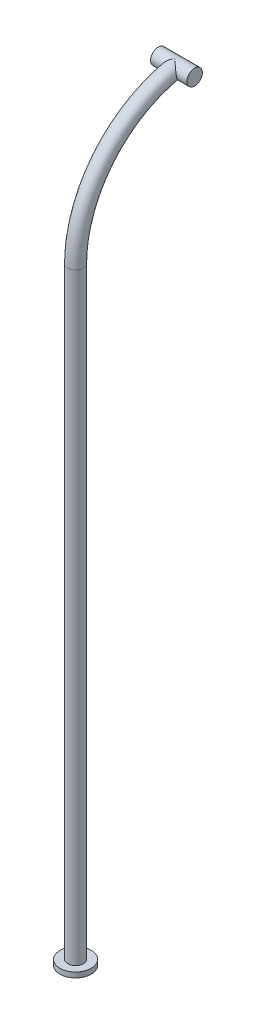
ISO-10303-21;
HEADER;
FILE_DESCRIPTION(('STEP AP214'),'2;1');
FILE_NAME('part.step','',(''),(''),'','','');
FILE_SCHEMA(('AUTOMOTIVE_DESIGN { 1 0 10303 214 1 1 1 1 }'));
ENDSEC;
DATA;
#1=APPLICATION_CONTEXT('core data for automotive mechanical design processes');
#2=APPLICATION_PROTOCOL_DEFINITION('international standard','automotive_design',2000,#1);
#3=PRODUCT_CONTEXT('',#1,'mechanical');
#4=PRODUCT('Part','Part','',(#3));
#5=PRODUCT_RELATED_PRODUCT_CATEGORY('part','',(#4));
#6=PRODUCT_DEFINITION_FORMATION('','',#4);
#7=PRODUCT_DEFINITION_CONTEXT('part definition',#1,'design');
#8=PRODUCT_DEFINITION('design','',#6,#7);
#9=PRODUCT_DEFINITION_SHAPE('','',#8);
#10=(LENGTH_UNIT() NAMED_UNIT(*) SI_UNIT(.MILLI.,.METRE.));
#11=(NAMED_UNIT(*) PLANE_ANGLE_UNIT() SI_UNIT($,.RADIAN.));
#12=(NAMED_UNIT(*) SI_UNIT($,.STERADIAN.) SOLID_ANGLE_UNIT());
#13=UNCERTAINTY_MEASURE_WITH_UNIT(LENGTH_MEASURE(1.E-05),#10,'distance_accuracy_value','');
#14=(GEOMETRIC_REPRESENTATION_CONTEXT(3) GLOBAL_UNCERTAINTY_ASSIGNED_CONTEXT((#13)) GLOBAL_UNIT_ASSIGNED_CONTEXT((#10,
#11,#12)) REPRESENTATION_CONTEXT('',''));
#15=CARTESIAN_POINT('',(0.,0.,0.));
#16=DIRECTION('',(0.,0.,1.));
#17=DIRECTION('',(1.,0.,0.));
#18=AXIS2_PLACEMENT_3D('',#15,#16,#17);
#19=CARTESIAN_POINT('',(0.,116.,0.));
#20=DIRECTION('',(0.,-1.,0.));
#21=DIRECTION('',(0.,0.,-1.));
#22=AXIS2_PLACEMENT_3D('',#19,#20,#21);
#23=CYLINDRICAL_SURFACE('',#22,1.5);
#24=CARTESIAN_POINT('',(0.,116.,0.));
#25=DIRECTION('',(0.,1.,0.));
#26=DIRECTION('',(0.,0.,1.));
#27=AXIS2_PLACEMENT_3D('',#24,#25,#26);
#28=CIRCLE('',#27,1.5);
#29=CARTESIAN_POINT('',(0.,116.,-1.5));
#30=VERTEX_POINT('',#29);
#31=EDGE_CURVE('E11',#30,#30,#28,.T.);
#32=CARTESIAN_POINT('',(0.,0.,0.));
#33=DIRECTION('',(0.,1.,0.));
#34=DIRECTION('',(0.,0.,1.));
#35=AXIS2_PLACEMENT_3D('',#32,#33,#34);
#36=CIRCLE('',#35,1.5);
#37=CARTESIAN_POINT('',(0.,0.,-1.5));
#38=VERTEX_POINT('',#37);
#39=EDGE_CURVE('E38',#38,#38,#36,.T.);
#40=CARTESIAN_POINT('',(0.,116.,-1.5));
#41=CARTESIAN_POINT('',(0.,114.791666666667,-1.5));
#42=CARTESIAN_POINT('',(0.,113.583333333333,-1.5));
#43=CARTESIAN_POINT('',(0.,111.166666666667,-1.5));
#44=CARTESIAN_POINT('',(0.,109.958333333333,-1.5));
#45=CARTESIAN_POINT('',(0.,107.541666666667,-1.5));
#46=CARTESIAN_POINT('',(0.,106.333333333333,-1.5));
#47=CARTESIAN_POINT('',(0.,103.916666666667,-1.5));
#48=CARTESIAN_POINT('',(0.,102.708333333333,-1.5));
#49=CARTESIAN_POINT('',(0.,100.291666666667,-1.5));
#50=CARTESIAN_POINT('',(0.,99.0833333333333,-1.5));
#51=CARTESIAN_POINT('',(0.,96.6666666666667,-1.5));
#52=CARTESIAN_POINT('',(0.,95.4583333333333,-1.5));
#53=CARTESIAN_POINT('',(0.,93.0416666666667,-1.5));
#54=CARTESIAN_POINT('',(0.,91.8333333333333,-1.5));
#55=CARTESIAN_POINT('',(0.,89.4166666666667,-1.5));
#56=CARTESIAN_POINT('',(0.,88.2083333333333,-1.5));
#57=CARTESIAN_POINT('',(0.,85.7916666666667,-1.5));
#58=CARTESIAN_POINT('',(0.,84.5833333333333,-1.5));
#59=CARTESIAN_POINT('',(0.,82.1666666666667,-1.5));
#60=CARTESIAN_POINT('',(0.,80.9583333333333,-1.5));
#61=CARTESIAN_POINT('',(0.,78.5416666666667,-1.5));
#62=CARTESIAN_POINT('',(0.,77.3333333333333,-1.5));
#63=CARTESIAN_POINT('',(0.,74.9166666666667,-1.5));
#64=CARTESIAN_POINT('',(0.,73.7083333333333,-1.5));
#65=CARTESIAN_POINT('',(0.,71.2916666666667,-1.5));
#66=CARTESIAN_POINT('',(0.,70.0833333333333,-1.5));
#67=CARTESIAN_POINT('',(0.,67.6666666666667,-1.5));
#68=CARTESIAN_POINT('',(0.,66.4583333333333,-1.5));
#69=CARTESIAN_POINT('',(0.,64.0416666666667,-1.5));
#70=CARTESIAN_POINT('',(0.,62.8333333333333,-1.5));
#71=CARTESIAN_POINT('',(0.,60.4166666666667,-1.5));
#72=CARTESIAN_POINT('',(0.,59.2083333333333,-1.5));
#73=CARTESIAN_POINT('',(0.,56.7916666666667,-1.5));
#74=CARTESIAN_POINT('',(0.,55.5833333333333,-1.5));
#75=CARTESIAN_POINT('',(0.,53.1666666666667,-1.5));
#76=CARTESIAN_POINT('',(0.,51.9583333333333,-1.5));
#77=CARTESIAN_POINT('',(0.,49.5416666666667,-1.5));
#78=CARTESIAN_POINT('',(0.,48.3333333333333,-1.5));
#79=CARTESIAN_POINT('',(0.,45.9166666666667,-1.5));
#80=CARTESIAN_POINT('',(0.,44.7083333333333,-1.5));
#81=CARTESIAN_POINT('',(0.,42.2916666666667,-1.5));
#82=CARTESIAN_POINT('',(0.,41.0833333333333,-1.5));
#83=CARTESIAN_POINT('',(0.,38.6666666666667,-1.5));
#84=CARTESIAN_POINT('',(0.,37.4583333333333,-1.5));
#85=CARTESIAN_POINT('',(0.,35.0416666666667,-1.5));
#86=CARTESIAN_POINT('',(0.,33.8333333333333,-1.5));
#87=CARTESIAN_POINT('',(0.,31.4166666666667,-1.5));
#88=CARTESIAN_POINT('',(0.,30.2083333333333,-1.5));
#89=CARTESIAN_POINT('',(0.,27.7916666666667,-1.5));
#90=CARTESIAN_POINT('',(0.,26.5833333333333,-1.5));
#91=CARTESIAN_POINT('',(0.,24.1666666666667,-1.5));
#92=CARTESIAN_POINT('',(0.,22.9583333333333,-1.5));
#93=CARTESIAN_POINT('',(0.,20.5416666666667,-1.5));
#94=CARTESIAN_POINT('',(0.,19.3333333333333,-1.5));
#95=CARTESIAN_POINT('',(0.,16.9166666666667,-1.5));
#96=CARTESIAN_POINT('',(0.,15.7083333333333,-1.5));
#97=CARTESIAN_POINT('',(0.,13.2916666666667,-1.5));
#98=CARTESIAN_POINT('',(0.,12.0833333333333,-1.5));
#99=CARTESIAN_POINT('',(0.,9.66666666666667,-1.5));
#100=CARTESIAN_POINT('',(0.,8.45833333333334,-1.5));
#101=CARTESIAN_POINT('',(0.,6.04166666666667,-1.5));
#102=CARTESIAN_POINT('',(0.,4.83333333333334,-1.5));
#103=CARTESIAN_POINT('',(0.,2.41666666666667,-1.5));
#104=CARTESIAN_POINT('',(0.,1.20833333333333,-1.5));
#105=CARTESIAN_POINT('',(0.,0.,-1.5));
#106=B_SPLINE_CURVE_WITH_KNOTS('',3,(#40,#41,#42,#43,#44,#45,#46,#47,#48,#49,#50,#51,#52,#53,
#54,#55,#56,#57,#58,#59,#60,#61,#62,#63,#64,#65,#66,#67,#68,#69,#70,#71,#72,#73,#74,#75,#76,#77,
#78,#79,#80,#81,#82,#83,#84,#85,#86,#87,#88,#89,#90,#91,#92,#93,#94,#95,#96,#97,#98,#99,#100,
#101,#102,#103,#104,#105),.UNSPECIFIED.,.F.,.F.,(4,2,2,2,2,2,2,2,2,2,2,2,2,2,2,2,2,2,2,2,2,2,2,
2,2,2,2,2,2,2,2,2,4),(0.,3.625,7.25000000000001,10.875,14.5,18.125,21.75,25.375,29.,32.625,
36.25,39.875,43.5,47.125,50.75,54.375,58.,61.625,65.25,68.875,72.5,76.125,79.75,83.375,87.,
90.625,94.25,97.875,101.5,105.125,108.75,112.375,116.),.UNSPECIFIED.);
#107=EDGE_CURVE('BSEAM35',#30,#38,#106,.T.);
#108=ORIENTED_EDGE('',*,*,#31,.F.);
#109=ORIENTED_EDGE('',*,*,#39,.T.);
#110=ORIENTED_EDGE('',*,*,#107,.T.);
#111=ORIENTED_EDGE('',*,*,#107,.F.);
#112=EDGE_LOOP('',(#108,#110,#109,#111));
#113=FACE_BOUND('',#112,.T.);
#114=ADVANCED_FACE('F35',(#113),#23,.T.);
#115=CARTESIAN_POINT('',(0.,-1.,0.));
#116=DIRECTION('',(0.,1.,0.));
#117=DIRECTION('',(0.,0.,1.));
#118=AXIS2_PLACEMENT_3D('',#115,#116,#117);
#119=CYLINDRICAL_SURFACE('',#118,3.);
#120=CARTESIAN_POINT('',(0.,-1.,0.));
#121=DIRECTION('',(0.,-1.,0.));
#122=DIRECTION('',(0.,0.,-1.));
#123=AXIS2_PLACEMENT_3D('',#120,#121,#122);
#124=CIRCLE('',#123,3.);
#125=CARTESIAN_POINT('',(0.,-1.,-3.));
#126=VERTEX_POINT('',#125);
#127=EDGE_CURVE('E60',#126,#126,#124,.T.);
#128=ORIENTED_EDGE('',*,*,#127,.F.);
#129=EDGE_LOOP('',(#128));
#130=FACE_BOUND('',#129,.T.);
#131=CARTESIAN_POINT('',(0.,0.,0.));
#132=DIRECTION('',(0.,-1.,0.));
#133=DIRECTION('',(0.,0.,-1.));
#134=AXIS2_PLACEMENT_3D('',#131,#132,#133);
#135=CIRCLE('',#134,3.);
#136=CARTESIAN_POINT('',(0.,0.,-3.));
#137=VERTEX_POINT('',#136);
#138=EDGE_CURVE('E57',#137,#137,#135,.T.);
#139=ORIENTED_EDGE('',*,*,#138,.T.);
#140=EDGE_LOOP('',(#139));
#141=FACE_BOUND('',#140,.T.);
#142=ADVANCED_FACE('F90',(#130,#141),#119,.T.);
#143=CARTESIAN_POINT('',(0.,-1.,0.));
#144=DIRECTION('',(0.,-1.,0.));
#145=DIRECTION('',(0.,0.,-1.));
#146=AXIS2_PLACEMENT_3D('',#143,#144,#145);
#147=PLANE('',#146);
#148=ORIENTED_EDGE('',*,*,#127,.T.);
#149=EDGE_LOOP('',(#148));
#150=FACE_BOUND('',#149,.T.);
#151=ADVANCED_FACE('F95',(#150),#147,.T.);
#152=CARTESIAN_POINT('',(0.,0.,0.));
#153=DIRECTION('',(0.,-1.,0.));
#154=DIRECTION('',(0.,0.,-1.));
#155=AXIS2_PLACEMENT_3D('',#152,#153,#154);
#156=PLANE('',#155);
#157=ORIENTED_EDGE('',*,*,#39,.F.);
#158=EDGE_LOOP('',(#157));
#159=FACE_BOUND('',#158,.T.);
#160=ORIENTED_EDGE('',*,*,#138,.F.);
#161=EDGE_LOOP('',(#160));
#162=FACE_BOUND('',#161,.T.);
#163=ADVANCED_FACE('F108',(#159,#162),#156,.F.);
#164=CARTESIAN_POINT('',(0.,116.,-23.5));
#165=DIRECTION('',(1.,0.,0.));
#166=DIRECTION('',(0.,0.,-1.));
#167=AXIS2_PLACEMENT_3D('',#164,#165,#166);
#168=TOROIDAL_SURFACE('',#167,23.5,1.5);
#169=CARTESIAN_POINT('',(0.,140.620193825305,-19.1587955583268));
#170=CARTESIAN_POINT('',(-0.00185370525353744,140.619861811997,-19.1569126554162));
#171=CARTESIAN_POINT('',(-0.00370746798022468,140.619526195106,-19.1550303276243));
#172=CARTESIAN_POINT('',(-0.115881057773036,140.599000089098,-19.0411666480326));
#173=CARTESIAN_POINT('',(-0.226377501892724,140.566052234373,-18.931253863264));
#174=CARTESIAN_POINT('',(-0.444772916299809,140.474622358396,-18.7191858927131));
#175=CARTESIAN_POINT('',(-0.552665436072314,140.416082668296,-18.6170488427424));
#176=CARTESIAN_POINT('',(-0.734320155371298,140.291643885346,-18.4505912529629));
#177=CARTESIAN_POINT('',(-0.809576325178933,140.231762220571,-18.3834034109835));
#178=CARTESIAN_POINT('',(-0.95439209606765,140.097278091331,-18.2583525801812));
#179=CARTESIAN_POINT('',(-1.02396394077781,140.022708513128,-18.2004692749422));
#180=CARTESIAN_POINT('',(-1.13745535009247,139.879851990233,-18.1107660185354));
#181=CARTESIAN_POINT('',(-1.18335127624719,139.814942007049,-18.0760787666043));
#182=CARTESIAN_POINT('',(-1.26851571888154,139.677082479366,-18.0155642587893));
#183=CARTESIAN_POINT('',(-1.30779253587499,139.604143196543,-17.9897258636069));
#184=CARTESIAN_POINT('',(-1.37020085833402,139.466918252286,-17.9533155103886));
#185=CARTESIAN_POINT('',(-1.39499155518933,139.403937274702,-17.9406968609073));
#186=CARTESIAN_POINT('',(-1.43752022044975,139.274542506387,-17.9236276863551));
#187=CARTESIAN_POINT('',(-1.45526275956155,139.208130972044,-17.9191718609258));
#188=CARTESIAN_POINT('',(-1.48246750306034,139.073069266053,-17.9193675436886));
#189=CARTESIAN_POINT('',(-1.49186701760019,139.004406100137,-17.9240871666456));
#190=CARTESIAN_POINT('',(-1.50120471128907,138.867772155485,-17.9431220038185));
#191=CARTESIAN_POINT('',(-1.5011487811936,138.799800972044,-17.9574312381576));
#192=CARTESIAN_POINT('',(-1.49206503096274,138.675146340182,-17.9927974484165));
#193=CARTESIAN_POINT('',(-1.48411659008735,138.618088240753,-18.0128364353359));
#194=CARTESIAN_POINT('',(-1.4613215345078,138.507972494756,-18.0590001867477));
#195=CARTESIAN_POINT('',(-1.44647398975482,138.454915388671,-18.0851257715204));
#196=CARTESIAN_POINT('',(-1.41025341699853,138.352460291901,-18.1430884490756));
#197=CARTESIAN_POINT('',(-1.38871871218164,138.303195601842,-18.1750579301857));
#198=CARTESIAN_POINT('',(-1.34033809671884,138.210406190437,-18.2429961925291));
#199=CARTESIAN_POINT('',(-1.3134896614116,138.166884214017,-18.278966871241));
#200=CARTESIAN_POINT('',(-1.23969169167342,138.063530443827,-18.3742498913955));
#201=CARTESIAN_POINT('',(-1.18975434313807,138.007711842341,-18.4356120184567));
#202=CARTESIAN_POINT('',(-1.08267213410522,137.909140910076,-18.5624589673257));
#203=CARTESIAN_POINT('',(-1.02550803418715,137.86642454109,-18.6279545513096));
#204=CARTESIAN_POINT('',(-0.881553762660437,137.777739851887,-18.7886501549181));
#205=CARTESIAN_POINT('',(-0.79229561778311,137.737745772154,-18.884922791443));
#206=CARTESIAN_POINT('',(-0.608208741647418,137.678737759365,-19.0783531238495));
#207=CARTESIAN_POINT('',(-0.513376598013812,137.659736822114,-19.1755113304679));
#208=CARTESIAN_POINT('',(-0.349423328825561,137.643519449176,-19.3400902135408));
#209=CARTESIAN_POINT('',(-0.281002385860906,137.64151895342,-19.4077989140199));
#210=CARTESIAN_POINT('',(-0.14356383140949,137.646512541199,-19.5420846724773));
#211=CARTESIAN_POINT('',(-0.074547475555191,137.653490869675,-19.6086635055293));
#212=CARTESIAN_POINT('',(-0.0037111561938256,137.665150215364,-19.6762033204511));
#213=CARTESIAN_POINT('',(-0.00185556137032428,137.665458808691,-19.6779720012934));
#214=CARTESIAN_POINT('',(0.,137.665770566269,-19.6797400913276));
#215=B_SPLINE_CURVE_WITH_KNOTS('',3,(#169,#170,#171,#172,#173,#174,#175,#176,#177,#178,#179,
#180,#181,#182,#183,#184,#185,#186,#187,#188,#189,#190,#191,#192,#193,#194,#195,#196,#197,#198,
#199,#200,#201,#202,#203,#204,#205,#206,#207,#208,#209,#210,#211,#212,#213,#214),.UNSPECIFIED.,
.F.,.F.,(4,2,2,2,2,2,2,2,2,2,2,2,2,2,2,2,2,2,2,2,2,2,4),(0.,0.00798936214706614,
0.483433668523736,0.959954912276058,1.31074225810996,1.66075294007201,1.92008962997727,
2.17909864592702,2.38484781402034,2.59046333579294,2.79761109261154,3.00462979655798,
3.18676139641827,3.36891755605444,3.5558747774848,3.7429210402574,4.03175669373842,
4.32137816528424,4.73089511210555,5.14066542860279,5.42911908157104,5.71706727723055,
5.72481324995938),.UNSPECIFIED.);
#216=CARTESIAN_POINT('',(0.,140.620193825305,-19.1587955583268));
#217=VERTEX_POINT('',#216);
#218=CARTESIAN_POINT('',(0.,137.665770566269,-19.6797400913276));
#219=VERTEX_POINT('',#218);
#220=EDGE_CURVE('E50',#217,#219,#215,.T.);
#221=ORIENTED_EDGE('',*,*,#220,.T.);
#222=CARTESIAN_POINT('',(0.,137.665770566269,-19.6797400913276));
#223=CARTESIAN_POINT('',(0.00185551671662994,137.665458822323,-19.6779720428394));
#224=CARTESIAN_POINT('',(0.00371111186187557,137.665150228725,-19.6762033617294));
#225=CARTESIAN_POINT('',(0.126021310422633,137.645018109903,-19.5595851690685));
#226=CARTESIAN_POINT('',(0.246770009248999,137.638477851673,-19.4420989575473));
#227=CARTESIAN_POINT('',(0.424986802578418,137.649807022725,-19.2644784068306));
#228=CARTESIAN_POINT('',(0.483998099055778,137.657134790076,-19.2049454088842));
#229=CARTESIAN_POINT('',(0.600499902060501,137.67926655826,-19.0857966125935));
#230=CARTESIAN_POINT('',(0.657991376611427,137.694065673414,-19.0261808937156));
#231=CARTESIAN_POINT('',(0.788185045789334,137.737459646485,-18.8890175035039));
#232=CARTESIAN_POINT('',(0.860113578591421,137.768900775206,-18.8116065409692));
#233=CARTESIAN_POINT('',(0.997981398084013,137.846963966027,-18.6592420316256));
#234=CARTESIAN_POINT('',(1.06393382962463,137.893551622103,-18.5842833351729));
#235=CARTESIAN_POINT('',(1.17144756656532,137.989855276253,-18.4575233246697));
#236=CARTESIAN_POINT('',(1.2149866240148,138.035883616443,-18.4046142493622));
#237=CARTESIAN_POINT('',(1.29511239442944,138.138016435008,-18.3033852553755));
#238=CARTESIAN_POINT('',(1.33170782286599,138.194108107671,-18.2550596223125));
#239=CARTESIAN_POINT('',(1.38932043184395,138.304152186474,-18.174256195726));
#240=CARTESIAN_POINT('',(1.41198789127558,138.356320267771,-18.1405365510623));
#241=CARTESIAN_POINT('',(1.45013986733255,138.466472054275,-18.0790054925247));
#242=CARTESIAN_POINT('',(1.46562951700792,138.524451567366,-18.0511898642644));
#243=CARTESIAN_POINT('',(1.48845117293184,138.645292682077,-18.0027358152113));
#244=CARTESIAN_POINT('',(1.4957354808542,138.708180580152,-17.9821398346347));
#245=CARTESIAN_POINT('',(1.50146155242806,138.83651192316,-17.9494186927207));
#246=CARTESIAN_POINT('',(1.49990519431048,138.90195482234,-17.9372917327245));
#247=CARTESIAN_POINT('',(1.48875406484943,139.026994290206,-17.9225570181584));
#248=CARTESIAN_POINT('',(1.4799158603276,139.086571926392,-17.9191727631652));
#249=CARTESIAN_POINT('',(1.455835607311,139.204383056781,-17.919367037355));
#250=CARTESIAN_POINT('',(1.44059247214326,139.262616321126,-17.9229467484321));
#251=CARTESIAN_POINT('',(1.40345802837158,139.380139159514,-17.9368788782709));
#252=CARTESIAN_POINT('',(1.38120881430049,139.439264723177,-17.9476431956137));
#253=CARTESIAN_POINT('',(1.33160276723545,139.55376153232,-17.9754056116038));
#254=CARTESIAN_POINT('',(1.3042429587417,139.609130564934,-17.9924073474002));
#255=CARTESIAN_POINT('',(1.22943222577786,139.744579954342,-18.0424045343334));
#256=CARTESIAN_POINT('',(1.17914030804178,139.821747643954,-18.0790712503376));
#257=CARTESIAN_POINT('',(1.07172665770132,139.965425688383,-18.1620865204402));
#258=CARTESIAN_POINT('',(1.01458808435471,140.031908782353,-18.2084591662491));
#259=CARTESIAN_POINT('',(0.874627311643364,140.175811239849,-18.3262465951938));
#260=CARTESIAN_POINT('',(0.789854153097938,140.248818069592,-18.4007252282577));
#261=CARTESIAN_POINT('',(0.615284337005717,140.376015811099,-18.5590636238577));
#262=CARTESIAN_POINT('',(0.525484849331493,140.430195996028,-18.6429286986391));
#263=CARTESIAN_POINT('',(0.36388888759806,140.510106678054,-18.7973995224793));
#264=CARTESIAN_POINT('',(0.292619514577947,140.539501096165,-18.8667083673103));
#265=CARTESIAN_POINT('',(0.149402808832152,140.587452983427,-19.008096185196));
#266=CARTESIAN_POINT('',(0.0774570219387448,140.606030941486,-19.0801696434389));
#267=CARTESIAN_POINT('',(0.00370748451991764,140.619526196649,-19.1550303099389));
#268=CARTESIAN_POINT('',(0.00185372171881972,140.619861813736,-19.1569126377718));
#269=CARTESIAN_POINT('',(0.,140.620193825305,-19.1587955583268));
#270=B_SPLINE_CURVE_WITH_KNOTS('',3,(#222,#223,#224,#225,#226,#227,#228,#229,#230,#231,#232,
#233,#234,#235,#236,#237,#238,#239,#240,#241,#242,#243,#244,#245,#246,#247,#248,#249,#250,#251,
#252,#253,#254,#255,#256,#257,#258,#259,#260,#261,#262,#263,#264,#265,#266,#267,#268,#269),
.UNSPECIFIED.,.F.,.F.,(4,2,2,2,2,2,2,2,2,2,2,2,2,2,2,2,2,2,2,2,2,2,2,4),(0.,0.00774597272883396,
0.510550925507703,0.762744102519327,1.01477257805362,1.34448431879618,1.67345227677969,
1.9202549232656,2.16674570967239,2.36432239054724,2.56175755999877,2.76033460721772,
2.9588694676152,3.13904707804887,3.31925527011689,3.5108002127267,3.70245702657629,
3.99821276973207,4.29471152310557,4.6957807639529,5.09707814829992,5.40751942146163,
5.71737071669235,5.72536007883942),.UNSPECIFIED.);
#271=EDGE_CURVE('E48',#219,#217,#270,.T.);
#272=ORIENTED_EDGE('',*,*,#271,.T.);
#273=EDGE_LOOP('',(#221,#272));
#274=FACE_BOUND('',#273,.T.);
#275=ORIENTED_EDGE('',*,*,#31,.T.);
#276=EDGE_LOOP('',(#275));
#277=FACE_BOUND('',#276,.T.);
#278=ADVANCED_FACE('F55',(#274,#277),#168,.T.);
#279=CARTESIAN_POINT('',(-3.5,139.142982195787,-19.4192678248272));
#280=DIRECTION('',(1.,0.,0.));
#281=DIRECTION('',(0.,0.,-1.));
#282=AXIS2_PLACEMENT_3D('',#279,#280,#281);
#283=CYLINDRICAL_SURFACE('',#282,1.5);
#284=CARTESIAN_POINT('',(3.5,139.142982195787,-19.4192678248272));
#285=DIRECTION('',(1.,0.,0.));
#286=DIRECTION('',(0.,0.,-1.));
#287=AXIS2_PLACEMENT_3D('',#284,#285,#286);
#288=CIRCLE('',#287,1.5);
#289=CARTESIAN_POINT('',(3.5,139.142982195787,-20.9192678248272));
#290=VERTEX_POINT('',#289);
#291=EDGE_CURVE('E158',#290,#290,#288,.T.);
#292=ORIENTED_EDGE('',*,*,#291,.F.);
#293=EDGE_LOOP('',(#292));
#294=FACE_BOUND('',#293,.T.);
#295=CARTESIAN_POINT('',(-3.5,139.142982195787,-19.4192678248272));
#296=DIRECTION('',(1.,0.,0.));
#297=DIRECTION('',(0.,0.,-1.));
#298=AXIS2_PLACEMENT_3D('',#295,#296,#297);
#299=CIRCLE('',#298,1.5);
#300=CARTESIAN_POINT('',(-3.5,139.142982195787,-20.9192678248272));
#301=VERTEX_POINT('',#300);
#302=EDGE_CURVE('E53',#301,#301,#299,.T.);
#303=ORIENTED_EDGE('',*,*,#302,.T.);
#304=EDGE_LOOP('',(#303));
#305=FACE_BOUND('',#304,.T.);
#306=ORIENTED_EDGE('',*,*,#271,.F.);
#307=ORIENTED_EDGE('',*,*,#220,.F.);
#308=EDGE_LOOP('',(#306,#307));
#309=FACE_BOUND('',#308,.T.);
#310=ADVANCED_FACE('F51',(#294,#305,#309),#283,.T.);
#311=CARTESIAN_POINT('',(-3.5,139.142982195787,-19.4192678248272));
#312=DIRECTION('',(1.,0.,0.));
#313=DIRECTION('',(0.,0.,-1.));
#314=AXIS2_PLACEMENT_3D('',#311,#312,#313);
#315=PLANE('',#314);
#316=ORIENTED_EDGE('',*,*,#302,.F.);
#317=EDGE_LOOP('',(#316));
#318=FACE_BOUND('',#317,.T.);
#319=ADVANCED_FACE('F77',(#318),#315,.F.);
#320=CARTESIAN_POINT('',(3.5,139.142982195787,-19.4192678248272));
#321=DIRECTION('',(1.,0.,0.));
#322=DIRECTION('',(0.,0.,-1.));
#323=AXIS2_PLACEMENT_3D('',#320,#321,#322);
#324=PLANE('',#323);
#325=ORIENTED_EDGE('',*,*,#291,.T.);
#326=EDGE_LOOP('',(#325));
#327=FACE_BOUND('',#326,.T.);
#328=ADVANCED_FACE('F82',(#327),#324,.T.);
#329=CLOSED_SHELL('',(#114,#142,#151,#163,#278,#310,#319,#328));
#330=MANIFOLD_SOLID_BREP('B2',#329);
#331=ADVANCED_BREP_SHAPE_REPRESENTATION('',(#18,#330),#14);
#332=SHAPE_DEFINITION_REPRESENTATION(#9,#331);
ENDSEC;
END-ISO-10303-21;
